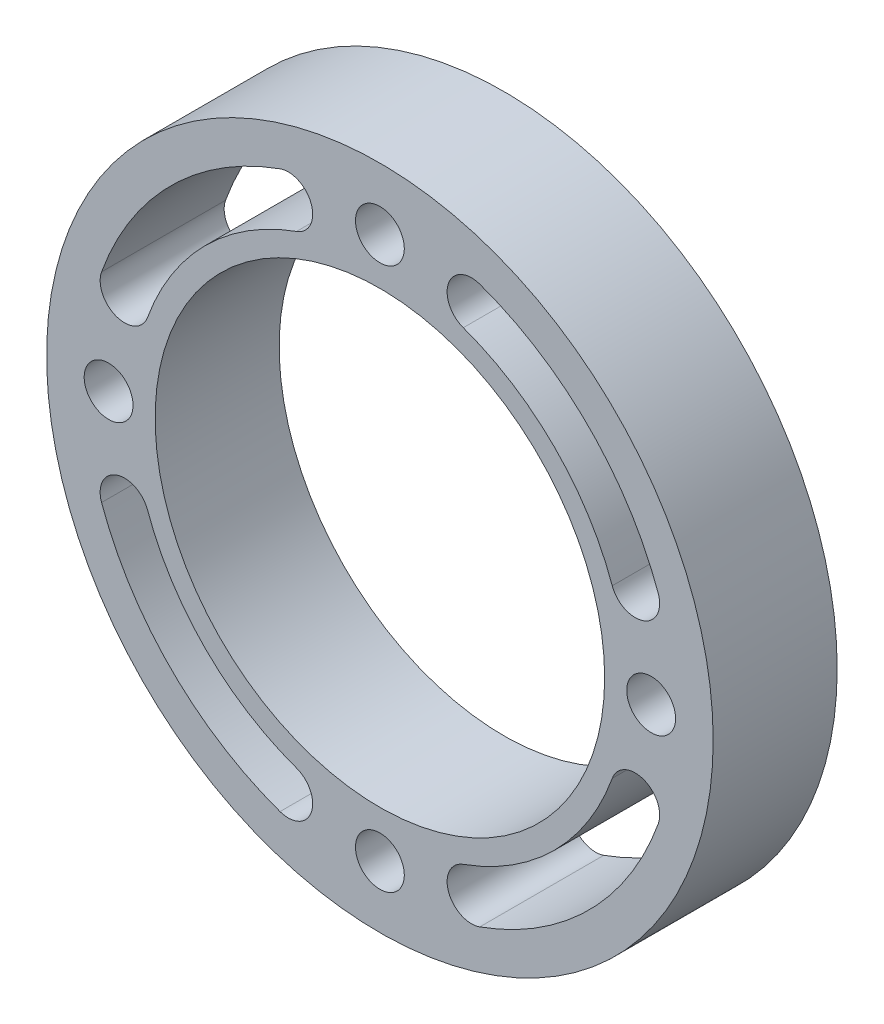
ISO-10303-21;
HEADER;
FILE_DESCRIPTION(('STEP AP214'),'2;1');
FILE_NAME('part.step','',(''),(''),'','','');
FILE_SCHEMA(('AUTOMOTIVE_DESIGN { 1 0 10303 214 1 1 1 1 }'));
ENDSEC;
DATA;
#1=APPLICATION_CONTEXT('core data for automotive mechanical design processes');
#2=APPLICATION_PROTOCOL_DEFINITION('international standard','automotive_design',2000,#1);
#3=PRODUCT_CONTEXT('',#1,'mechanical');
#4=PRODUCT('Part','Part','',(#3));
#5=PRODUCT_RELATED_PRODUCT_CATEGORY('part','',(#4));
#6=PRODUCT_DEFINITION_FORMATION('','',#4);
#7=PRODUCT_DEFINITION_CONTEXT('part definition',#1,'design');
#8=PRODUCT_DEFINITION('design','',#6,#7);
#9=PRODUCT_DEFINITION_SHAPE('','',#8);
#10=(LENGTH_UNIT() NAMED_UNIT(*) SI_UNIT(.MILLI.,.METRE.));
#11=(NAMED_UNIT(*) PLANE_ANGLE_UNIT() SI_UNIT($,.RADIAN.));
#12=(NAMED_UNIT(*) SI_UNIT($,.STERADIAN.) SOLID_ANGLE_UNIT());
#13=UNCERTAINTY_MEASURE_WITH_UNIT(LENGTH_MEASURE(1.E-05),#10,'distance_accuracy_value','');
#14=(GEOMETRIC_REPRESENTATION_CONTEXT(3) GLOBAL_UNCERTAINTY_ASSIGNED_CONTEXT((#13)) GLOBAL_UNIT_ASSIGNED_CONTEXT((#10,
#11,#12)) REPRESENTATION_CONTEXT('',''));
#15=CARTESIAN_POINT('',(0.,0.,0.));
#16=DIRECTION('',(0.,0.,1.));
#17=DIRECTION('',(1.,0.,0.));
#18=AXIS2_PLACEMENT_3D('',#15,#16,#17);
#19=CARTESIAN_POINT('',(0.,0.,8.));
#20=DIRECTION('',(0.,0.,1.));
#21=DIRECTION('',(1.,0.,0.));
#22=AXIS2_PLACEMENT_3D('',#19,#20,#21);
#23=PLANE('',#22);
#24=CARTESIAN_POINT('',(0.,-17.5,8.));
#25=DIRECTION('',(0.,0.,1.));
#26=DIRECTION('',(1.,0.,0.));
#27=AXIS2_PLACEMENT_3D('',#24,#25,#26);
#28=CIRCLE('',#27,1.575);
#29=CARTESIAN_POINT('',(1.57500000000001,-17.5,8.));
#30=VERTEX_POINT('',#29);
#31=EDGE_CURVE('E295',#30,#30,#28,.T.);
#32=ORIENTED_EDGE('',*,*,#31,.F.);
#33=EDGE_LOOP('',(#32));
#34=FACE_BOUND('',#33,.T.);
#35=CARTESIAN_POINT('',(-16.4714285714286,5.91117930842286,8.));
#36=DIRECTION('',(0.,0.,1.));
#37=DIRECTION('',(1.,0.,0.));
#38=AXIS2_PLACEMENT_3D('',#35,#36,#37);
#39=CIRCLE('',#38,1.575);
#40=CARTESIAN_POINT('',(-17.9538571428571,6.44318544618091,8.));
#41=VERTEX_POINT('',#40);
#42=CARTESIAN_POINT('',(-14.989,5.3791731706648,8.));
#43=VERTEX_POINT('',#42);
#44=EDGE_CURVE('E314',#41,#43,#39,.T.);
#45=ORIENTED_EDGE('',*,*,#44,.F.);
#46=CARTESIAN_POINT('',(0.,0.,8.));
#47=DIRECTION('',(0.,0.,1.));
#48=DIRECTION('',(1.,0.,0.));
#49=AXIS2_PLACEMENT_3D('',#46,#47,#48);
#50=CIRCLE('',#49,19.075);
#51=CARTESIAN_POINT('',(-6.44318544618092,17.9538571428571,8.));
#52=VERTEX_POINT('',#51);
#53=EDGE_CURVE('E311',#52,#41,#50,.T.);
#54=ORIENTED_EDGE('',*,*,#53,.F.);
#55=CARTESIAN_POINT('',(-5.91117930842286,16.4714285714286,8.));
#56=DIRECTION('',(0.,0.,1.));
#57=DIRECTION('',(1.,0.,0.));
#58=AXIS2_PLACEMENT_3D('',#55,#56,#57);
#59=CIRCLE('',#58,1.57500000000001);
#60=CARTESIAN_POINT('',(-5.3791731706648,14.989,8.));
#61=VERTEX_POINT('',#60);
#62=EDGE_CURVE('E322',#61,#52,#59,.T.);
#63=ORIENTED_EDGE('',*,*,#62,.F.);
#64=CARTESIAN_POINT('',(0.,0.,8.));
#65=DIRECTION('',(0.,0.,-1.));
#66=DIRECTION('',(1.,0.,0.));
#67=AXIS2_PLACEMENT_3D('',#64,#65,#66);
#68=CIRCLE('',#67,15.925);
#69=EDGE_CURVE('E318',#43,#61,#68,.T.);
#70=ORIENTED_EDGE('',*,*,#69,.F.);
#71=EDGE_LOOP('',(#45,#54,#63,#70));
#72=FACE_BOUND('',#71,.T.);
#73=CARTESIAN_POINT('',(0.,17.5,8.));
#74=DIRECTION('',(0.,0.,1.));
#75=DIRECTION('',(1.,0.,0.));
#76=AXIS2_PLACEMENT_3D('',#73,#74,#75);
#77=CIRCLE('',#76,1.575);
#78=CARTESIAN_POINT('',(1.575,17.5,8.));
#79=VERTEX_POINT('',#78);
#80=EDGE_CURVE('E354',#79,#79,#77,.T.);
#81=ORIENTED_EDGE('',*,*,#80,.F.);
#82=EDGE_LOOP('',(#81));
#83=FACE_BOUND('',#82,.T.);
#84=CARTESIAN_POINT('',(0.,0.,8.));
#85=DIRECTION('',(0.,0.,1.));
#86=DIRECTION('',(1.,0.,0.));
#87=AXIS2_PLACEMENT_3D('',#84,#85,#86);
#88=CIRCLE('',#87,21.5);
#89=CARTESIAN_POINT('',(21.5,0.,8.));
#90=VERTEX_POINT('',#89);
#91=EDGE_CURVE('E11',#90,#90,#88,.T.);
#92=ORIENTED_EDGE('',*,*,#91,.T.);
#93=EDGE_LOOP('',(#92));
#94=FACE_BOUND('',#93,.T.);
#95=CARTESIAN_POINT('',(0.,0.,8.));
#96=DIRECTION('',(0.,0.,1.));
#97=DIRECTION('',(1.,0.,0.));
#98=AXIS2_PLACEMENT_3D('',#95,#96,#97);
#99=CIRCLE('',#98,14.5);
#100=CARTESIAN_POINT('',(14.5,0.,8.));
#101=VERTEX_POINT('',#100);
#102=EDGE_CURVE('E362',#101,#101,#99,.T.);
#103=ORIENTED_EDGE('',*,*,#102,.F.);
#104=EDGE_LOOP('',(#103));
#105=FACE_BOUND('',#104,.T.);
#106=CARTESIAN_POINT('',(17.5,0.,8.));
#107=DIRECTION('',(0.,0.,1.));
#108=DIRECTION('',(1.,0.,0.));
#109=AXIS2_PLACEMENT_3D('',#106,#107,#108);
#110=CIRCLE('',#109,1.575);
#111=CARTESIAN_POINT('',(19.075,0.,8.));
#112=VERTEX_POINT('',#111);
#113=EDGE_CURVE('E303',#112,#112,#110,.T.);
#114=ORIENTED_EDGE('',*,*,#113,.F.);
#115=EDGE_LOOP('',(#114));
#116=FACE_BOUND('',#115,.T.);
#117=CARTESIAN_POINT('',(-17.5,0.,8.));
#118=DIRECTION('',(0.,0.,1.));
#119=DIRECTION('',(1.,0.,0.));
#120=AXIS2_PLACEMENT_3D('',#117,#118,#119);
#121=CIRCLE('',#120,1.575);
#122=CARTESIAN_POINT('',(-15.925,0.,8.));
#123=VERTEX_POINT('',#122);
#124=EDGE_CURVE('E287',#123,#123,#121,.T.);
#125=ORIENTED_EDGE('',*,*,#124,.F.);
#126=EDGE_LOOP('',(#125));
#127=FACE_BOUND('',#126,.T.);
#128=CARTESIAN_POINT('',(0.,0.,8.));
#129=DIRECTION('',(0.,0.,-1.));
#130=DIRECTION('',(-1.,0.,0.));
#131=AXIS2_PLACEMENT_3D('',#128,#129,#130);
#132=CIRCLE('',#131,15.925);
#133=CARTESIAN_POINT('',(5.3791731706648,14.989,8.));
#134=VERTEX_POINT('',#133);
#135=CARTESIAN_POINT('',(14.989,5.3791731706648,8.));
#136=VERTEX_POINT('',#135);
#137=EDGE_CURVE('E247',#134,#136,#132,.T.);
#138=ORIENTED_EDGE('',*,*,#137,.F.);
#139=CARTESIAN_POINT('',(5.91117930842286,16.4714285714286,8.));
#140=DIRECTION('',(0.,0.,1.));
#141=DIRECTION('',(-1.,0.,0.));
#142=AXIS2_PLACEMENT_3D('',#139,#140,#141);
#143=CIRCLE('',#142,1.57500000000001);
#144=CARTESIAN_POINT('',(6.44318544618091,17.9538571428571,8.));
#145=VERTEX_POINT('',#144);
#146=EDGE_CURVE('E244',#145,#134,#143,.T.);
#147=ORIENTED_EDGE('',*,*,#146,.F.);
#148=CARTESIAN_POINT('',(0.,0.,8.));
#149=DIRECTION('',(0.,0.,1.));
#150=DIRECTION('',(-1.,0.,0.));
#151=AXIS2_PLACEMENT_3D('',#148,#149,#150);
#152=CIRCLE('',#151,19.075);
#153=CARTESIAN_POINT('',(17.9538571428571,6.44318544618092,8.));
#154=VERTEX_POINT('',#153);
#155=EDGE_CURVE('E255',#154,#145,#152,.T.);
#156=ORIENTED_EDGE('',*,*,#155,.F.);
#157=CARTESIAN_POINT('',(16.4714285714286,5.91117930842286,8.));
#158=DIRECTION('',(0.,0.,1.));
#159=DIRECTION('',(-1.,0.,0.));
#160=AXIS2_PLACEMENT_3D('',#157,#158,#159);
#161=CIRCLE('',#160,1.575);
#162=EDGE_CURVE('E251',#136,#154,#161,.T.);
#163=ORIENTED_EDGE('',*,*,#162,.F.);
#164=EDGE_LOOP('',(#138,#147,#156,#163));
#165=FACE_BOUND('',#164,.T.);
#166=CARTESIAN_POINT('',(5.91117930842286,-16.4714285714286,8.));
#167=DIRECTION('',(0.,0.,1.));
#168=DIRECTION('',(1.,0.,0.));
#169=AXIS2_PLACEMENT_3D('',#166,#167,#168);
#170=CIRCLE('',#169,1.57500000000001);
#171=CARTESIAN_POINT('',(5.3791731706648,-14.989,8.));
#172=VERTEX_POINT('',#171);
#173=CARTESIAN_POINT('',(6.44318544618092,-17.9538571428571,8.));
#174=VERTEX_POINT('',#173);
#175=EDGE_CURVE('E204',#172,#174,#170,.T.);
#176=ORIENTED_EDGE('',*,*,#175,.F.);
#177=CARTESIAN_POINT('',(0.,0.,8.));
#178=DIRECTION('',(0.,0.,-1.));
#179=DIRECTION('',(1.,0.,0.));
#180=AXIS2_PLACEMENT_3D('',#177,#178,#179);
#181=CIRCLE('',#180,15.925);
#182=CARTESIAN_POINT('',(14.989,-5.3791731706648,8.));
#183=VERTEX_POINT('',#182);
#184=EDGE_CURVE('E201',#183,#172,#181,.T.);
#185=ORIENTED_EDGE('',*,*,#184,.F.);
#186=CARTESIAN_POINT('',(16.4714285714286,-5.91117930842286,8.));
#187=DIRECTION('',(0.,0.,1.));
#188=DIRECTION('',(1.,0.,0.));
#189=AXIS2_PLACEMENT_3D('',#186,#187,#188);
#190=CIRCLE('',#189,1.575);
#191=CARTESIAN_POINT('',(17.9538571428571,-6.44318544618092,8.));
#192=VERTEX_POINT('',#191);
#193=EDGE_CURVE('E212',#192,#183,#190,.T.);
#194=ORIENTED_EDGE('',*,*,#193,.F.);
#195=CARTESIAN_POINT('',(0.,0.,8.));
#196=DIRECTION('',(0.,0.,1.));
#197=DIRECTION('',(1.,0.,0.));
#198=AXIS2_PLACEMENT_3D('',#195,#196,#197);
#199=CIRCLE('',#198,19.075);
#200=EDGE_CURVE('E208',#174,#192,#199,.T.);
#201=ORIENTED_EDGE('',*,*,#200,.F.);
#202=EDGE_LOOP('',(#176,#185,#194,#201));
#203=FACE_BOUND('',#202,.T.);
#204=CARTESIAN_POINT('',(0.,0.,8.));
#205=DIRECTION('',(0.,0.,-1.));
#206=DIRECTION('',(-1.,0.,0.));
#207=AXIS2_PLACEMENT_3D('',#204,#205,#206);
#208=CIRCLE('',#207,15.925);
#209=CARTESIAN_POINT('',(-5.3791731706648,-14.989,8.));
#210=VERTEX_POINT('',#209);
#211=CARTESIAN_POINT('',(-14.989,-5.3791731706648,8.));
#212=VERTEX_POINT('',#211);
#213=EDGE_CURVE('E162',#210,#212,#208,.T.);
#214=ORIENTED_EDGE('',*,*,#213,.F.);
#215=CARTESIAN_POINT('',(-5.91117930842286,-16.4714285714286,8.));
#216=DIRECTION('',(0.,0.,1.));
#217=DIRECTION('',(-1.,0.,0.));
#218=AXIS2_PLACEMENT_3D('',#215,#216,#217);
#219=CIRCLE('',#218,1.57500000000001);
#220=CARTESIAN_POINT('',(-6.44318544618092,-17.9538571428571,8.));
#221=VERTEX_POINT('',#220);
#222=EDGE_CURVE('E153',#221,#210,#219,.T.);
#223=ORIENTED_EDGE('',*,*,#222,.F.);
#224=CARTESIAN_POINT('',(0.,0.,8.));
#225=DIRECTION('',(0.,0.,1.));
#226=DIRECTION('',(-1.,0.,0.));
#227=AXIS2_PLACEMENT_3D('',#224,#225,#226);
#228=CIRCLE('',#227,19.075);
#229=CARTESIAN_POINT('',(-17.9538571428571,-6.44318544618092,8.));
#230=VERTEX_POINT('',#229);
#231=EDGE_CURVE('E179',#230,#221,#228,.T.);
#232=ORIENTED_EDGE('',*,*,#231,.F.);
#233=CARTESIAN_POINT('',(-16.4714285714286,-5.91117930842286,8.));
#234=DIRECTION('',(0.,0.,1.));
#235=DIRECTION('',(-1.,0.,0.));
#236=AXIS2_PLACEMENT_3D('',#233,#234,#235);
#237=CIRCLE('',#236,1.575);
#238=EDGE_CURVE('E175',#212,#230,#237,.T.);
#239=ORIENTED_EDGE('',*,*,#238,.F.);
#240=EDGE_LOOP('',(#214,#223,#232,#239));
#241=FACE_BOUND('',#240,.T.);
#242=ADVANCED_FACE('F39',(#34,#72,#83,#94,#105,#116,#127,#165,#203,#241),#23,.T.);
#243=CARTESIAN_POINT('',(0.,0.,0.));
#244=DIRECTION('',(0.,0.,1.));
#245=DIRECTION('',(1.,0.,0.));
#246=AXIS2_PLACEMENT_3D('',#243,#244,#245);
#247=PLANE('',#246);
#248=CARTESIAN_POINT('',(0.,0.,0.));
#249=DIRECTION('',(0.,0.,-1.));
#250=DIRECTION('',(1.,0.,0.));
#251=AXIS2_PLACEMENT_3D('',#248,#249,#250);
#252=CIRCLE('',#251,15.925);
#253=CARTESIAN_POINT('',(14.989,-5.3791731706648,0.));
#254=VERTEX_POINT('',#253);
#255=CARTESIAN_POINT('',(5.3791731706648,-14.989,0.));
#256=VERTEX_POINT('',#255);
#257=EDGE_CURVE('E171',#254,#256,#252,.T.);
#258=ORIENTED_EDGE('',*,*,#257,.T.);
#259=CARTESIAN_POINT('',(5.91117930842286,-16.4714285714286,0.));
#260=DIRECTION('',(0.,0.,1.));
#261=DIRECTION('',(1.,0.,0.));
#262=AXIS2_PLACEMENT_3D('',#259,#260,#261);
#263=CIRCLE('',#262,1.57500000000001);
#264=CARTESIAN_POINT('',(6.44318544618092,-17.9538571428571,0.));
#265=VERTEX_POINT('',#264);
#266=EDGE_CURVE('E219',#256,#265,#263,.T.);
#267=ORIENTED_EDGE('',*,*,#266,.T.);
#268=CARTESIAN_POINT('',(0.,0.,0.));
#269=DIRECTION('',(0.,0.,1.));
#270=DIRECTION('',(1.,0.,0.));
#271=AXIS2_PLACEMENT_3D('',#268,#269,#270);
#272=CIRCLE('',#271,19.075);
#273=CARTESIAN_POINT('',(17.9538571428571,-6.44318544618092,0.));
#274=VERTEX_POINT('',#273);
#275=EDGE_CURVE('E223',#265,#274,#272,.T.);
#276=ORIENTED_EDGE('',*,*,#275,.T.);
#277=CARTESIAN_POINT('',(16.4714285714286,-5.91117930842286,0.));
#278=DIRECTION('',(0.,0.,1.));
#279=DIRECTION('',(1.,0.,0.));
#280=AXIS2_PLACEMENT_3D('',#277,#278,#279);
#281=CIRCLE('',#280,1.575);
#282=EDGE_CURVE('E205',#274,#254,#281,.T.);
#283=ORIENTED_EDGE('',*,*,#282,.T.);
#284=EDGE_LOOP('',(#258,#267,#276,#283));
#285=FACE_BOUND('',#284,.T.);
#286=CARTESIAN_POINT('',(-17.5,0.,0.));
#287=DIRECTION('',(0.,0.,1.));
#288=DIRECTION('',(1.,0.,0.));
#289=AXIS2_PLACEMENT_3D('',#286,#287,#288);
#290=CIRCLE('',#289,1.575);
#291=CARTESIAN_POINT('',(-15.925,0.,0.));
#292=VERTEX_POINT('',#291);
#293=EDGE_CURVE('E286',#292,#292,#290,.T.);
#294=ORIENTED_EDGE('',*,*,#293,.T.);
#295=EDGE_LOOP('',(#294));
#296=FACE_BOUND('',#295,.T.);
#297=CARTESIAN_POINT('',(0.,-17.5,0.));
#298=DIRECTION('',(0.,0.,1.));
#299=DIRECTION('',(1.,0.,0.));
#300=AXIS2_PLACEMENT_3D('',#297,#298,#299);
#301=CIRCLE('',#300,1.575);
#302=CARTESIAN_POINT('',(1.57500000000001,-17.5,0.));
#303=VERTEX_POINT('',#302);
#304=EDGE_CURVE('E291',#303,#303,#301,.T.);
#305=ORIENTED_EDGE('',*,*,#304,.T.);
#306=EDGE_LOOP('',(#305));
#307=FACE_BOUND('',#306,.T.);
#308=CARTESIAN_POINT('',(17.5,0.,0.));
#309=DIRECTION('',(0.,0.,1.));
#310=DIRECTION('',(1.,0.,0.));
#311=AXIS2_PLACEMENT_3D('',#308,#309,#310);
#312=CIRCLE('',#311,1.575);
#313=CARTESIAN_POINT('',(19.075,0.,0.));
#314=VERTEX_POINT('',#313);
#315=EDGE_CURVE('E299',#314,#314,#312,.T.);
#316=ORIENTED_EDGE('',*,*,#315,.T.);
#317=EDGE_LOOP('',(#316));
#318=FACE_BOUND('',#317,.T.);
#319=CARTESIAN_POINT('',(0.,0.,0.));
#320=DIRECTION('',(0.,0.,1.));
#321=DIRECTION('',(1.,0.,0.));
#322=AXIS2_PLACEMENT_3D('',#319,#320,#321);
#323=CIRCLE('',#322,19.075);
#324=CARTESIAN_POINT('',(-6.44318544618092,17.9538571428571,0.));
#325=VERTEX_POINT('',#324);
#326=CARTESIAN_POINT('',(-17.9538571428571,6.44318544618091,0.));
#327=VERTEX_POINT('',#326);
#328=EDGE_CURVE('E307',#325,#327,#323,.T.);
#329=ORIENTED_EDGE('',*,*,#328,.T.);
#330=CARTESIAN_POINT('',(-16.4714285714286,5.91117930842286,0.));
#331=DIRECTION('',(0.,0.,1.));
#332=DIRECTION('',(1.,0.,0.));
#333=AXIS2_PLACEMENT_3D('',#330,#331,#332);
#334=CIRCLE('',#333,1.575);
#335=CARTESIAN_POINT('',(-14.989,5.3791731706648,0.));
#336=VERTEX_POINT('',#335);
#337=EDGE_CURVE('E329',#327,#336,#334,.T.);
#338=ORIENTED_EDGE('',*,*,#337,.T.);
#339=CARTESIAN_POINT('',(0.,0.,0.));
#340=DIRECTION('',(0.,0.,-1.));
#341=DIRECTION('',(1.,0.,0.));
#342=AXIS2_PLACEMENT_3D('',#339,#340,#341);
#343=CIRCLE('',#342,15.925);
#344=CARTESIAN_POINT('',(-5.3791731706648,14.989,0.));
#345=VERTEX_POINT('',#344);
#346=EDGE_CURVE('E333',#336,#345,#343,.T.);
#347=ORIENTED_EDGE('',*,*,#346,.T.);
#348=CARTESIAN_POINT('',(-5.91117930842286,16.4714285714286,0.));
#349=DIRECTION('',(0.,0.,1.));
#350=DIRECTION('',(1.,0.,0.));
#351=AXIS2_PLACEMENT_3D('',#348,#349,#350);
#352=CIRCLE('',#351,1.57500000000001);
#353=EDGE_CURVE('E315',#345,#325,#352,.T.);
#354=ORIENTED_EDGE('',*,*,#353,.T.);
#355=EDGE_LOOP('',(#329,#338,#347,#354));
#356=FACE_BOUND('',#355,.T.);
#357=CARTESIAN_POINT('',(0.,0.,0.));
#358=DIRECTION('',(0.,0.,1.));
#359=DIRECTION('',(1.,0.,0.));
#360=AXIS2_PLACEMENT_3D('',#357,#358,#359);
#361=CIRCLE('',#360,21.5);
#362=CARTESIAN_POINT('',(21.5,0.,0.));
#363=VERTEX_POINT('',#362);
#364=EDGE_CURVE('E43',#363,#363,#361,.T.);
#365=ORIENTED_EDGE('',*,*,#364,.F.);
#366=EDGE_LOOP('',(#365));
#367=FACE_BOUND('',#366,.T.);
#368=CARTESIAN_POINT('',(0.,0.,0.));
#369=DIRECTION('',(0.,0.,1.));
#370=DIRECTION('',(1.,0.,0.));
#371=AXIS2_PLACEMENT_3D('',#368,#369,#370);
#372=CIRCLE('',#371,14.5);
#373=CARTESIAN_POINT('',(14.5,0.,0.));
#374=VERTEX_POINT('',#373);
#375=EDGE_CURVE('E358',#374,#374,#372,.T.);
#376=ORIENTED_EDGE('',*,*,#375,.T.);
#377=EDGE_LOOP('',(#376));
#378=FACE_BOUND('',#377,.T.);
#379=CARTESIAN_POINT('',(0.,17.5,0.));
#380=DIRECTION('',(0.,0.,1.));
#381=DIRECTION('',(1.,0.,0.));
#382=AXIS2_PLACEMENT_3D('',#379,#380,#381);
#383=CIRCLE('',#382,1.575);
#384=CARTESIAN_POINT('',(1.575,17.5,0.));
#385=VERTEX_POINT('',#384);
#386=EDGE_CURVE('E353',#385,#385,#383,.T.);
#387=ORIENTED_EDGE('',*,*,#386,.T.);
#388=EDGE_LOOP('',(#387));
#389=FACE_BOUND('',#388,.T.);
#390=CARTESIAN_POINT('',(5.91117930842286,16.4714285714286,0.));
#391=DIRECTION('',(0.,0.,1.));
#392=DIRECTION('',(-1.,0.,0.));
#393=AXIS2_PLACEMENT_3D('',#390,#391,#392);
#394=CIRCLE('',#393,1.57500000000001);
#395=CARTESIAN_POINT('',(6.44318544618091,17.9538571428571,0.));
#396=VERTEX_POINT('',#395);
#397=CARTESIAN_POINT('',(5.3791731706648,14.989,0.));
#398=VERTEX_POINT('',#397);
#399=EDGE_CURVE('E243',#396,#398,#394,.T.);
#400=ORIENTED_EDGE('',*,*,#399,.T.);
#401=CARTESIAN_POINT('',(0.,0.,0.));
#402=DIRECTION('',(0.,0.,-1.));
#403=DIRECTION('',(-1.,0.,0.));
#404=AXIS2_PLACEMENT_3D('',#401,#402,#403);
#405=CIRCLE('',#404,15.925);
#406=CARTESIAN_POINT('',(14.989,5.3791731706648,0.));
#407=VERTEX_POINT('',#406);
#408=EDGE_CURVE('E262',#398,#407,#405,.T.);
#409=ORIENTED_EDGE('',*,*,#408,.T.);
#410=CARTESIAN_POINT('',(16.4714285714286,5.91117930842286,0.));
#411=DIRECTION('',(0.,0.,1.));
#412=DIRECTION('',(-1.,0.,0.));
#413=AXIS2_PLACEMENT_3D('',#410,#411,#412);
#414=CIRCLE('',#413,1.575);
#415=CARTESIAN_POINT('',(17.9538571428571,6.44318544618091,0.));
#416=VERTEX_POINT('',#415);
#417=EDGE_CURVE('E266',#407,#416,#414,.T.);
#418=ORIENTED_EDGE('',*,*,#417,.T.);
#419=CARTESIAN_POINT('',(0.,0.,0.));
#420=DIRECTION('',(0.,0.,1.));
#421=DIRECTION('',(-1.,0.,0.));
#422=AXIS2_PLACEMENT_3D('',#419,#420,#421);
#423=CIRCLE('',#422,19.075);
#424=EDGE_CURVE('E248',#416,#396,#423,.T.);
#425=ORIENTED_EDGE('',*,*,#424,.T.);
#426=EDGE_LOOP('',(#400,#409,#418,#425));
#427=FACE_BOUND('',#426,.T.);
#428=CARTESIAN_POINT('',(-5.91117930842286,-16.4714285714286,0.));
#429=DIRECTION('',(0.,0.,1.));
#430=DIRECTION('',(-1.,0.,0.));
#431=AXIS2_PLACEMENT_3D('',#428,#429,#430);
#432=CIRCLE('',#431,1.57500000000001);
#433=CARTESIAN_POINT('',(-6.44318544618092,-17.9538571428571,0.));
#434=VERTEX_POINT('',#433);
#435=CARTESIAN_POINT('',(-5.3791731706648,-14.989,0.));
#436=VERTEX_POINT('',#435);
#437=EDGE_CURVE('E63',#434,#436,#432,.T.);
#438=ORIENTED_EDGE('',*,*,#437,.T.);
#439=CARTESIAN_POINT('',(0.,0.,0.));
#440=DIRECTION('',(0.,0.,-1.));
#441=DIRECTION('',(-1.,0.,0.));
#442=AXIS2_PLACEMENT_3D('',#439,#440,#441);
#443=CIRCLE('',#442,15.925);
#444=CARTESIAN_POINT('',(-14.989,-5.3791731706648,0.));
#445=VERTEX_POINT('',#444);
#446=EDGE_CURVE('E169',#436,#445,#443,.T.);
#447=ORIENTED_EDGE('',*,*,#446,.T.);
#448=CARTESIAN_POINT('',(-16.4714285714286,-5.91117930842286,0.));
#449=DIRECTION('',(0.,0.,1.));
#450=DIRECTION('',(-1.,0.,0.));
#451=AXIS2_PLACEMENT_3D('',#448,#449,#450);
#452=CIRCLE('',#451,1.575);
#453=CARTESIAN_POINT('',(-17.9538571428571,-6.44318544618091,0.));
#454=VERTEX_POINT('',#453);
#455=EDGE_CURVE('E188',#445,#454,#452,.T.);
#456=ORIENTED_EDGE('',*,*,#455,.T.);
#457=CARTESIAN_POINT('',(0.,0.,0.));
#458=DIRECTION('',(0.,0.,1.));
#459=DIRECTION('',(-1.,0.,0.));
#460=AXIS2_PLACEMENT_3D('',#457,#458,#459);
#461=CIRCLE('',#460,19.075);
#462=EDGE_CURVE('E163',#454,#434,#461,.T.);
#463=ORIENTED_EDGE('',*,*,#462,.T.);
#464=EDGE_LOOP('',(#438,#447,#456,#463));
#465=FACE_BOUND('',#464,.T.);
#466=ADVANCED_FACE('F370',(#285,#296,#307,#318,#356,#367,#378,#389,#427,#465),#247,.F.);
#467=CARTESIAN_POINT('',(0.,0.,8.));
#468=DIRECTION('',(0.,0.,-1.));
#469=DIRECTION('',(-1.,0.,0.));
#470=AXIS2_PLACEMENT_3D('',#467,#468,#469);
#471=CYLINDRICAL_SURFACE('',#470,21.5);
#472=ORIENTED_EDGE('',*,*,#91,.F.);
#473=EDGE_LOOP('',(#472));
#474=FACE_BOUND('',#473,.T.);
#475=ORIENTED_EDGE('',*,*,#364,.T.);
#476=EDGE_LOOP('',(#475));
#477=FACE_BOUND('',#476,.T.);
#478=ADVANCED_FACE('F41',(#474,#477),#471,.T.);
#479=CARTESIAN_POINT('',(0.,0.,8.));
#480=DIRECTION('',(0.,0.,-1.));
#481=DIRECTION('',(-1.,0.,0.));
#482=AXIS2_PLACEMENT_3D('',#479,#480,#481);
#483=CYLINDRICAL_SURFACE('',#482,14.5);
#484=ORIENTED_EDGE('',*,*,#102,.T.);
#485=EDGE_LOOP('',(#484));
#486=FACE_BOUND('',#485,.T.);
#487=ORIENTED_EDGE('',*,*,#375,.F.);
#488=EDGE_LOOP('',(#487));
#489=FACE_BOUND('',#488,.T.);
#490=ADVANCED_FACE('F373',(#486,#489),#483,.F.);
#491=CARTESIAN_POINT('',(0.,17.5,8.));
#492=DIRECTION('',(0.,0.,-1.));
#493=DIRECTION('',(-1.,0.,0.));
#494=AXIS2_PLACEMENT_3D('',#491,#492,#493);
#495=CYLINDRICAL_SURFACE('',#494,1.575);
#496=ORIENTED_EDGE('',*,*,#80,.T.);
#497=EDGE_LOOP('',(#496));
#498=FACE_BOUND('',#497,.T.);
#499=ORIENTED_EDGE('',*,*,#386,.F.);
#500=EDGE_LOOP('',(#499));
#501=FACE_BOUND('',#500,.T.);
#502=ADVANCED_FACE('F375',(#498,#501),#495,.F.);
#503=CARTESIAN_POINT('',(0.,0.,8.));
#504=DIRECTION('',(0.,0.,-1.));
#505=DIRECTION('',(-1.,0.,0.));
#506=AXIS2_PLACEMENT_3D('',#503,#504,#505);
#507=CYLINDRICAL_SURFACE('',#506,19.075);
#508=ORIENTED_EDGE('',*,*,#328,.F.);
#509=DIRECTION('',(0.,0.,-1.));
#510=VECTOR('',#509,1.);
#511=CARTESIAN_POINT('',(-6.44318544618092,17.9538571428571,8.));
#512=LINE('',#511,#510);
#513=EDGE_CURVE('E325',#52,#325,#512,.T.);
#514=ORIENTED_EDGE('',*,*,#513,.F.);
#515=ORIENTED_EDGE('',*,*,#53,.T.);
#516=DIRECTION('',(0.,0.,-1.));
#517=VECTOR('',#516,1.);
#518=CARTESIAN_POINT('',(-17.9538571428571,6.44318544618091,8.));
#519=LINE('',#518,#517);
#520=EDGE_CURVE('E349',#41,#327,#519,.T.);
#521=ORIENTED_EDGE('',*,*,#520,.T.);
#522=EDGE_LOOP('',(#508,#514,#515,#521));
#523=FACE_BOUND('',#522,.T.);
#524=ADVANCED_FACE('F382',(#523),#507,.F.);
#525=CARTESIAN_POINT('',(-16.4714285714286,5.91117930842286,8.));
#526=DIRECTION('',(0.,0.,-1.));
#527=DIRECTION('',(-1.,0.,0.));
#528=AXIS2_PLACEMENT_3D('',#525,#526,#527);
#529=CYLINDRICAL_SURFACE('',#528,1.575);
#530=ORIENTED_EDGE('',*,*,#337,.F.);
#531=ORIENTED_EDGE('',*,*,#520,.F.);
#532=ORIENTED_EDGE('',*,*,#44,.T.);
#533=DIRECTION('',(0.,0.,-1.));
#534=VECTOR('',#533,1.);
#535=CARTESIAN_POINT('',(-14.989,5.3791731706648,8.));
#536=LINE('',#535,#534);
#537=EDGE_CURVE('E346',#43,#336,#536,.T.);
#538=ORIENTED_EDGE('',*,*,#537,.T.);
#539=EDGE_LOOP('',(#530,#531,#532,#538));
#540=FACE_BOUND('',#539,.T.);
#541=ADVANCED_FACE('F480',(#540),#529,.F.);
#542=CARTESIAN_POINT('',(0.,0.,8.));
#543=DIRECTION('',(0.,0.,-1.));
#544=DIRECTION('',(-1.,0.,0.));
#545=AXIS2_PLACEMENT_3D('',#542,#543,#544);
#546=CYLINDRICAL_SURFACE('',#545,15.925);
#547=ORIENTED_EDGE('',*,*,#346,.F.);
#548=ORIENTED_EDGE('',*,*,#537,.F.);
#549=ORIENTED_EDGE('',*,*,#69,.T.);
#550=DIRECTION('',(0.,0.,-1.));
#551=VECTOR('',#550,1.);
#552=CARTESIAN_POINT('',(-5.3791731706648,14.989,8.));
#553=LINE('',#552,#551);
#554=EDGE_CURVE('E343',#61,#345,#553,.T.);
#555=ORIENTED_EDGE('',*,*,#554,.T.);
#556=EDGE_LOOP('',(#547,#548,#549,#555));
#557=FACE_BOUND('',#556,.T.);
#558=ADVANCED_FACE('F476',(#557),#546,.T.);
#559=CARTESIAN_POINT('',(-5.91117930842286,16.4714285714286,8.));
#560=DIRECTION('',(0.,0.,-1.));
#561=DIRECTION('',(-1.,0.,0.));
#562=AXIS2_PLACEMENT_3D('',#559,#560,#561);
#563=CYLINDRICAL_SURFACE('',#562,1.57500000000001);
#564=ORIENTED_EDGE('',*,*,#353,.F.);
#565=ORIENTED_EDGE('',*,*,#554,.F.);
#566=ORIENTED_EDGE('',*,*,#62,.T.);
#567=ORIENTED_EDGE('',*,*,#513,.T.);
#568=EDGE_LOOP('',(#564,#565,#566,#567));
#569=FACE_BOUND('',#568,.T.);
#570=ADVANCED_FACE('F472',(#569),#563,.F.);
#571=CARTESIAN_POINT('',(17.5,0.,8.));
#572=DIRECTION('',(0.,0.,-1.));
#573=DIRECTION('',(-1.,0.,0.));
#574=AXIS2_PLACEMENT_3D('',#571,#572,#573);
#575=CYLINDRICAL_SURFACE('',#574,1.575);
#576=ORIENTED_EDGE('',*,*,#113,.T.);
#577=EDGE_LOOP('',(#576));
#578=FACE_BOUND('',#577,.T.);
#579=ORIENTED_EDGE('',*,*,#315,.F.);
#580=EDGE_LOOP('',(#579));
#581=FACE_BOUND('',#580,.T.);
#582=ADVANCED_FACE('F468',(#578,#581),#575,.F.);
#583=CARTESIAN_POINT('',(0.,-17.5,8.));
#584=DIRECTION('',(0.,0.,-1.));
#585=DIRECTION('',(-1.,0.,0.));
#586=AXIS2_PLACEMENT_3D('',#583,#584,#585);
#587=CYLINDRICAL_SURFACE('',#586,1.575);
#588=ORIENTED_EDGE('',*,*,#31,.T.);
#589=EDGE_LOOP('',(#588));
#590=FACE_BOUND('',#589,.T.);
#591=ORIENTED_EDGE('',*,*,#304,.F.);
#592=EDGE_LOOP('',(#591));
#593=FACE_BOUND('',#592,.T.);
#594=ADVANCED_FACE('F464',(#590,#593),#587,.F.);
#595=CARTESIAN_POINT('',(-17.5,0.,8.));
#596=DIRECTION('',(0.,0.,-1.));
#597=DIRECTION('',(-1.,0.,0.));
#598=AXIS2_PLACEMENT_3D('',#595,#596,#597);
#599=CYLINDRICAL_SURFACE('',#598,1.575);
#600=ORIENTED_EDGE('',*,*,#124,.T.);
#601=EDGE_LOOP('',(#600));
#602=FACE_BOUND('',#601,.T.);
#603=ORIENTED_EDGE('',*,*,#293,.F.);
#604=EDGE_LOOP('',(#603));
#605=FACE_BOUND('',#604,.T.);
#606=ADVANCED_FACE('F460',(#602,#605),#599,.F.);
#607=CARTESIAN_POINT('',(5.91117930842286,16.4714285714286,8.));
#608=DIRECTION('',(0.,0.,-1.));
#609=DIRECTION('',(-1.,0.,0.));
#610=AXIS2_PLACEMENT_3D('',#607,#608,#609);
#611=CYLINDRICAL_SURFACE('',#610,1.57500000000001);
#612=ORIENTED_EDGE('',*,*,#399,.F.);
#613=DIRECTION('',(0.,0.,-1.));
#614=VECTOR('',#613,1.);
#615=CARTESIAN_POINT('',(6.44318544618091,17.9538571428571,8.));
#616=LINE('',#615,#614);
#617=EDGE_CURVE('E258',#145,#396,#616,.T.);
#618=ORIENTED_EDGE('',*,*,#617,.F.);
#619=ORIENTED_EDGE('',*,*,#146,.T.);
#620=DIRECTION('',(0.,0.,-1.));
#621=VECTOR('',#620,1.);
#622=CARTESIAN_POINT('',(5.3791731706648,14.989,8.));
#623=LINE('',#622,#621);
#624=EDGE_CURVE('E282',#134,#398,#623,.T.);
#625=ORIENTED_EDGE('',*,*,#624,.T.);
#626=EDGE_LOOP('',(#612,#618,#619,#625));
#627=FACE_BOUND('',#626,.T.);
#628=ADVANCED_FACE('F456',(#627),#611,.F.);
#629=CARTESIAN_POINT('',(0.,0.,8.));
#630=DIRECTION('',(0.,0.,-1.));
#631=DIRECTION('',(-1.,0.,0.));
#632=AXIS2_PLACEMENT_3D('',#629,#630,#631);
#633=CYLINDRICAL_SURFACE('',#632,15.925);
#634=ORIENTED_EDGE('',*,*,#408,.F.);
#635=ORIENTED_EDGE('',*,*,#624,.F.);
#636=ORIENTED_EDGE('',*,*,#137,.T.);
#637=DIRECTION('',(0.,0.,-1.));
#638=VECTOR('',#637,1.);
#639=CARTESIAN_POINT('',(14.989,5.3791731706648,8.));
#640=LINE('',#639,#638);
#641=EDGE_CURVE('E279',#136,#407,#640,.T.);
#642=ORIENTED_EDGE('',*,*,#641,.T.);
#643=EDGE_LOOP('',(#634,#635,#636,#642));
#644=FACE_BOUND('',#643,.T.);
#645=ADVANCED_FACE('F452',(#644),#633,.T.);
#646=CARTESIAN_POINT('',(16.4714285714286,5.91117930842286,8.));
#647=DIRECTION('',(0.,0.,-1.));
#648=DIRECTION('',(-1.,0.,0.));
#649=AXIS2_PLACEMENT_3D('',#646,#647,#648);
#650=CYLINDRICAL_SURFACE('',#649,1.575);
#651=ORIENTED_EDGE('',*,*,#417,.F.);
#652=ORIENTED_EDGE('',*,*,#641,.F.);
#653=ORIENTED_EDGE('',*,*,#162,.T.);
#654=DIRECTION('',(0.,0.,-1.));
#655=VECTOR('',#654,1.);
#656=CARTESIAN_POINT('',(17.9538571428571,6.44318544618091,8.));
#657=LINE('',#656,#655);
#658=EDGE_CURVE('E276',#154,#416,#657,.T.);
#659=ORIENTED_EDGE('',*,*,#658,.T.);
#660=EDGE_LOOP('',(#651,#652,#653,#659));
#661=FACE_BOUND('',#660,.T.);
#662=ADVANCED_FACE('F448',(#661),#650,.F.);
#663=CARTESIAN_POINT('',(0.,0.,8.));
#664=DIRECTION('',(0.,0.,-1.));
#665=DIRECTION('',(-1.,0.,0.));
#666=AXIS2_PLACEMENT_3D('',#663,#664,#665);
#667=CYLINDRICAL_SURFACE('',#666,19.075);
#668=ORIENTED_EDGE('',*,*,#424,.F.);
#669=ORIENTED_EDGE('',*,*,#658,.F.);
#670=ORIENTED_EDGE('',*,*,#155,.T.);
#671=ORIENTED_EDGE('',*,*,#617,.T.);
#672=EDGE_LOOP('',(#668,#669,#670,#671));
#673=FACE_BOUND('',#672,.T.);
#674=ADVANCED_FACE('F445',(#673),#667,.F.);
#675=CARTESIAN_POINT('',(0.,0.,8.));
#676=DIRECTION('',(0.,0.,-1.));
#677=DIRECTION('',(-1.,0.,0.));
#678=AXIS2_PLACEMENT_3D('',#675,#676,#677);
#679=CYLINDRICAL_SURFACE('',#678,15.925);
#680=ORIENTED_EDGE('',*,*,#257,.F.);
#681=DIRECTION('',(0.,0.,-1.));
#682=VECTOR('',#681,1.);
#683=CARTESIAN_POINT('',(14.989,-5.3791731706648,8.));
#684=LINE('',#683,#682);
#685=EDGE_CURVE('E215',#183,#254,#684,.T.);
#686=ORIENTED_EDGE('',*,*,#685,.F.);
#687=ORIENTED_EDGE('',*,*,#184,.T.);
#688=DIRECTION('',(0.,0.,-1.));
#689=VECTOR('',#688,1.);
#690=CARTESIAN_POINT('',(5.3791731706648,-14.989,8.));
#691=LINE('',#690,#689);
#692=EDGE_CURVE('E239',#172,#256,#691,.T.);
#693=ORIENTED_EDGE('',*,*,#692,.T.);
#694=EDGE_LOOP('',(#680,#686,#687,#693));
#695=FACE_BOUND('',#694,.T.);
#696=ADVANCED_FACE('F427',(#695),#679,.T.);
#697=CARTESIAN_POINT('',(5.91117930842286,-16.4714285714286,8.));
#698=DIRECTION('',(0.,0.,-1.));
#699=DIRECTION('',(-1.,0.,0.));
#700=AXIS2_PLACEMENT_3D('',#697,#698,#699);
#701=CYLINDRICAL_SURFACE('',#700,1.57500000000001);
#702=ORIENTED_EDGE('',*,*,#266,.F.);
#703=ORIENTED_EDGE('',*,*,#692,.F.);
#704=ORIENTED_EDGE('',*,*,#175,.T.);
#705=DIRECTION('',(0.,0.,-1.));
#706=VECTOR('',#705,1.);
#707=CARTESIAN_POINT('',(6.44318544618092,-17.9538571428571,8.));
#708=LINE('',#707,#706);
#709=EDGE_CURVE('E236',#174,#265,#708,.T.);
#710=ORIENTED_EDGE('',*,*,#709,.T.);
#711=EDGE_LOOP('',(#702,#703,#704,#710));
#712=FACE_BOUND('',#711,.T.);
#713=ADVANCED_FACE('F420',(#712),#701,.F.);
#714=CARTESIAN_POINT('',(0.,0.,8.));
#715=DIRECTION('',(0.,0.,-1.));
#716=DIRECTION('',(-1.,0.,0.));
#717=AXIS2_PLACEMENT_3D('',#714,#715,#716);
#718=CYLINDRICAL_SURFACE('',#717,19.075);
#719=ORIENTED_EDGE('',*,*,#275,.F.);
#720=ORIENTED_EDGE('',*,*,#709,.F.);
#721=ORIENTED_EDGE('',*,*,#200,.T.);
#722=DIRECTION('',(0.,0.,-1.));
#723=VECTOR('',#722,1.);
#724=CARTESIAN_POINT('',(17.9538571428571,-6.44318544618092,8.));
#725=LINE('',#724,#723);
#726=EDGE_CURVE('E233',#192,#274,#725,.T.);
#727=ORIENTED_EDGE('',*,*,#726,.T.);
#728=EDGE_LOOP('',(#719,#720,#721,#727));
#729=FACE_BOUND('',#728,.T.);
#730=ADVANCED_FACE('F423',(#729),#718,.F.);
#731=CARTESIAN_POINT('',(16.4714285714286,-5.91117930842286,8.));
#732=DIRECTION('',(0.,0.,-1.));
#733=DIRECTION('',(-1.,0.,0.));
#734=AXIS2_PLACEMENT_3D('',#731,#732,#733);
#735=CYLINDRICAL_SURFACE('',#734,1.575);
#736=ORIENTED_EDGE('',*,*,#282,.F.);
#737=ORIENTED_EDGE('',*,*,#726,.F.);
#738=ORIENTED_EDGE('',*,*,#193,.T.);
#739=ORIENTED_EDGE('',*,*,#685,.T.);
#740=EDGE_LOOP('',(#736,#737,#738,#739));
#741=FACE_BOUND('',#740,.T.);
#742=ADVANCED_FACE('F430',(#741),#735,.F.);
#743=CARTESIAN_POINT('',(-5.91117930842286,-16.4714285714286,8.));
#744=DIRECTION('',(0.,0.,-1.));
#745=DIRECTION('',(-1.,0.,0.));
#746=AXIS2_PLACEMENT_3D('',#743,#744,#745);
#747=CYLINDRICAL_SURFACE('',#746,1.57500000000001);
#748=ORIENTED_EDGE('',*,*,#437,.F.);
#749=DIRECTION('',(0.,0.,-1.));
#750=VECTOR('',#749,1.);
#751=CARTESIAN_POINT('',(-6.44318544618092,-17.9538571428571,8.));
#752=LINE('',#751,#750);
#753=EDGE_CURVE('E157',#221,#434,#752,.T.);
#754=ORIENTED_EDGE('',*,*,#753,.F.);
#755=ORIENTED_EDGE('',*,*,#222,.T.);
#756=DIRECTION('',(0.,0.,-1.));
#757=VECTOR('',#756,1.);
#758=CARTESIAN_POINT('',(-5.3791731706648,-14.989,8.));
#759=LINE('',#758,#757);
#760=EDGE_CURVE('E156',#210,#436,#759,.T.);
#761=ORIENTED_EDGE('',*,*,#760,.T.);
#762=EDGE_LOOP('',(#748,#754,#755,#761));
#763=FACE_BOUND('',#762,.T.);
#764=ADVANCED_FACE('F155',(#763),#747,.F.);
#765=CARTESIAN_POINT('',(0.,0.,8.));
#766=DIRECTION('',(0.,0.,-1.));
#767=DIRECTION('',(-1.,0.,0.));
#768=AXIS2_PLACEMENT_3D('',#765,#766,#767);
#769=CYLINDRICAL_SURFACE('',#768,15.925);
#770=ORIENTED_EDGE('',*,*,#446,.F.);
#771=ORIENTED_EDGE('',*,*,#760,.F.);
#772=ORIENTED_EDGE('',*,*,#213,.T.);
#773=DIRECTION('',(0.,0.,-1.));
#774=VECTOR('',#773,1.);
#775=CARTESIAN_POINT('',(-14.989,-5.3791731706648,8.));
#776=LINE('',#775,#774);
#777=EDGE_CURVE('E172',#212,#445,#776,.T.);
#778=ORIENTED_EDGE('',*,*,#777,.T.);
#779=EDGE_LOOP('',(#770,#771,#772,#778));
#780=FACE_BOUND('',#779,.T.);
#781=ADVANCED_FACE('F166',(#780),#769,.T.);
#782=CARTESIAN_POINT('',(-16.4714285714286,-5.91117930842286,8.));
#783=DIRECTION('',(0.,0.,-1.));
#784=DIRECTION('',(-1.,0.,0.));
#785=AXIS2_PLACEMENT_3D('',#782,#783,#784);
#786=CYLINDRICAL_SURFACE('',#785,1.575);
#787=ORIENTED_EDGE('',*,*,#455,.F.);
#788=ORIENTED_EDGE('',*,*,#777,.F.);
#789=ORIENTED_EDGE('',*,*,#238,.T.);
#790=DIRECTION('',(0.,0.,-1.));
#791=VECTOR('',#790,1.);
#792=CARTESIAN_POINT('',(-17.9538571428571,-6.44318544618091,8.));
#793=LINE('',#792,#791);
#794=EDGE_CURVE('E55',#230,#454,#793,.T.);
#795=ORIENTED_EDGE('',*,*,#794,.T.);
#796=EDGE_LOOP('',(#787,#788,#789,#795));
#797=FACE_BOUND('',#796,.T.);
#798=ADVANCED_FACE('F574',(#797),#786,.F.);
#799=CARTESIAN_POINT('',(0.,0.,8.));
#800=DIRECTION('',(0.,0.,-1.));
#801=DIRECTION('',(-1.,0.,0.));
#802=AXIS2_PLACEMENT_3D('',#799,#800,#801);
#803=CYLINDRICAL_SURFACE('',#802,19.075);
#804=ORIENTED_EDGE('',*,*,#462,.F.);
#805=ORIENTED_EDGE('',*,*,#794,.F.);
#806=ORIENTED_EDGE('',*,*,#231,.T.);
#807=ORIENTED_EDGE('',*,*,#753,.T.);
#808=EDGE_LOOP('',(#804,#805,#806,#807));
#809=FACE_BOUND('',#808,.T.);
#810=ADVANCED_FACE('F582',(#809),#803,.F.);
#811=CLOSED_SHELL('',(#242,#466,#478,#490,#502,#524,#541,#558,#570,#582,#594,#606,#628,#645,
#662,#674,#696,#713,#730,#742,#764,#781,#798,#810));
#812=MANIFOLD_SOLID_BREP('B2',#811);
#813=ADVANCED_BREP_SHAPE_REPRESENTATION('',(#18,#812),#14);
#814=SHAPE_DEFINITION_REPRESENTATION(#9,#813);
ENDSEC;
END-ISO-10303-21;
